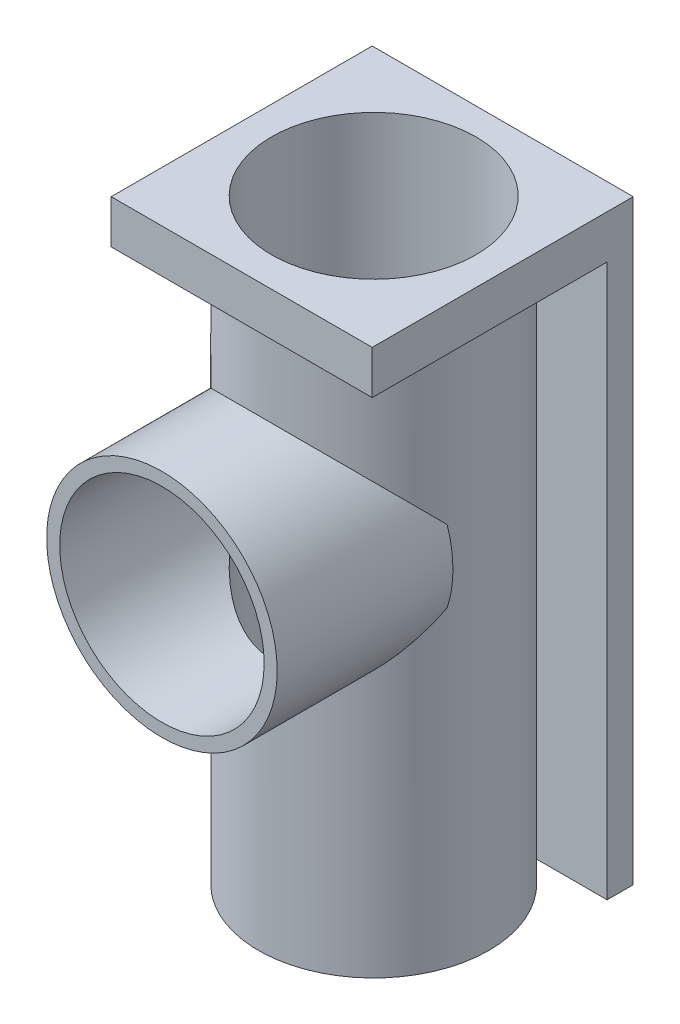
ISO-10303-21;
HEADER;
FILE_DESCRIPTION(('STEP AP214'),'2;1');
FILE_NAME('part.step','',(''),(''),'','','');
FILE_SCHEMA(('AUTOMOTIVE_DESIGN { 1 0 10303 214 1 1 1 1 }'));
ENDSEC;
DATA;
#1=APPLICATION_CONTEXT('core data for automotive mechanical design processes');
#2=APPLICATION_PROTOCOL_DEFINITION('international standard','automotive_design',2000,#1);
#3=PRODUCT_CONTEXT('',#1,'mechanical');
#4=PRODUCT('Part','Part','',(#3));
#5=PRODUCT_RELATED_PRODUCT_CATEGORY('part','',(#4));
#6=PRODUCT_DEFINITION_FORMATION('','',#4);
#7=PRODUCT_DEFINITION_CONTEXT('part definition',#1,'design');
#8=PRODUCT_DEFINITION('design','',#6,#7);
#9=PRODUCT_DEFINITION_SHAPE('','',#8);
#10=(LENGTH_UNIT() NAMED_UNIT(*) SI_UNIT(.MILLI.,.METRE.));
#11=(NAMED_UNIT(*) PLANE_ANGLE_UNIT() SI_UNIT($,.RADIAN.));
#12=(NAMED_UNIT(*) SI_UNIT($,.STERADIAN.) SOLID_ANGLE_UNIT());
#13=UNCERTAINTY_MEASURE_WITH_UNIT(LENGTH_MEASURE(1.E-05),#10,'distance_accuracy_value','');
#14=(GEOMETRIC_REPRESENTATION_CONTEXT(3) GLOBAL_UNCERTAINTY_ASSIGNED_CONTEXT((#13)) GLOBAL_UNIT_ASSIGNED_CONTEXT((#10,
#11,#12)) REPRESENTATION_CONTEXT('',''));
#15=CARTESIAN_POINT('',(0.,0.,0.));
#16=DIRECTION('',(0.,0.,1.));
#17=DIRECTION('',(1.,0.,0.));
#18=AXIS2_PLACEMENT_3D('',#15,#16,#17);
#19=CARTESIAN_POINT('',(0.,0.,-40.8));
#20=DIRECTION('',(0.,0.,-1.));
#21=DIRECTION('',(-1.,0.,0.));
#22=AXIS2_PLACEMENT_3D('',#19,#20,#21);
#23=PLANE('',#22);
#24=CARTESIAN_POINT('',(0.,0.,-40.8));
#25=DIRECTION('',(0.,0.,1.));
#26=DIRECTION('',(1.,0.,0.));
#27=AXIS2_PLACEMENT_3D('',#24,#25,#26);
#28=CIRCLE('',#27,23.5);
#29=CARTESIAN_POINT('',(22.1368062487982,-7.88744629795789,-40.8));
#30=VERTEX_POINT('',#29);
#31=CARTESIAN_POINT('',(22.1368062487981,7.88744629795797,-40.8));
#32=VERTEX_POINT('',#31);
#33=EDGE_CURVE('E154',#30,#32,#28,.T.);
#34=ORIENTED_EDGE('',*,*,#33,.T.);
#35=DIRECTION('',(0.,-1.,0.));
#36=VECTOR('',#35,1.);
#37=CARTESIAN_POINT('',(22.1368062487981,-80.,-40.8));
#38=LINE('',#37,#36);
#39=EDGE_CURVE('E146',#32,#30,#38,.T.);
#40=ORIENTED_EDGE('',*,*,#39,.T.);
#41=EDGE_LOOP('',(#34,#40));
#42=FACE_BOUND('',#41,.T.);
#43=ADVANCED_FACE('F34',(#42),#23,.F.);
#44=CARTESIAN_POINT('',(-30.,57.,-18.3453956246376));
#45=DIRECTION('',(-1.,0.,0.));
#46=DIRECTION('',(0.,0.,1.));
#47=AXIS2_PLACEMENT_3D('',#44,#45,#46);
#48=PLANE('',#47);
#49=DIRECTION('',(0.,0.,-1.));
#50=VECTOR('',#49,1.);
#51=CARTESIAN_POINT('',(-30.,47.,-18.3453956246376));
#52=LINE('',#51,#50);
#53=CARTESIAN_POINT('',(-30.,47.,-18.3453956246376));
#54=VERTEX_POINT('',#53);
#55=CARTESIAN_POINT('',(-30.,47.,-72.3453956246376));
#56=VERTEX_POINT('',#55);
#57=EDGE_CURVE('E240',#54,#56,#52,.T.);
#58=ORIENTED_EDGE('',*,*,#57,.F.);
#59=DIRECTION('',(0.,-1.,0.));
#60=VECTOR('',#59,1.);
#61=CARTESIAN_POINT('',(-30.,57.,-18.3453956246376));
#62=LINE('',#61,#60);
#63=CARTESIAN_POINT('',(-30.,57.,-18.3453956246376));
#64=VERTEX_POINT('',#63);
#65=EDGE_CURVE('E260',#64,#54,#62,.T.);
#66=ORIENTED_EDGE('',*,*,#65,.F.);
#67=DIRECTION('',(0.,0.,-1.));
#68=VECTOR('',#67,1.);
#69=CARTESIAN_POINT('',(-30.,57.,-18.3453956246376));
#70=LINE('',#69,#68);
#71=CARTESIAN_POINT('',(-30.,57.,-78.3453956246376));
#72=VERTEX_POINT('',#71);
#73=EDGE_CURVE('E241',#64,#72,#70,.T.);
#74=ORIENTED_EDGE('',*,*,#73,.T.);
#75=DIRECTION('',(0.,-1.,0.));
#76=VECTOR('',#75,1.);
#77=CARTESIAN_POINT('',(-30.,57.,-78.3453956246376));
#78=LINE('',#77,#76);
#79=CARTESIAN_POINT('',(-30.,-80.,-78.3453956246376));
#80=VERTEX_POINT('',#79);
#81=EDGE_CURVE('E254',#72,#80,#78,.T.);
#82=ORIENTED_EDGE('',*,*,#81,.T.);
#83=DIRECTION('',(0.,0.,-1.));
#84=VECTOR('',#83,1.);
#85=CARTESIAN_POINT('',(-30.,-80.,-78.3453956246376));
#86=LINE('',#85,#84);
#87=CARTESIAN_POINT('',(-30.,-80.,-72.3453956246376));
#88=VERTEX_POINT('',#87);
#89=EDGE_CURVE('E211',#88,#80,#86,.T.);
#90=ORIENTED_EDGE('',*,*,#89,.F.);
#91=DIRECTION('',(0.,1.,0.));
#92=VECTOR('',#91,1.);
#93=CARTESIAN_POINT('',(-30.,-80.,-72.3453956246376));
#94=LINE('',#93,#92);
#95=EDGE_CURVE('E234',#88,#56,#94,.T.);
#96=ORIENTED_EDGE('',*,*,#95,.T.);
#97=EDGE_LOOP('',(#58,#66,#74,#82,#90,#96));
#98=FACE_BOUND('',#97,.T.);
#99=ADVANCED_FACE('F36',(#98),#48,.T.);
#100=CARTESIAN_POINT('',(30.,57.,-18.3453956246376));
#101=DIRECTION('',(0.,0.,1.));
#102=DIRECTION('',(1.,0.,0.));
#103=AXIS2_PLACEMENT_3D('',#100,#101,#102);
#104=PLANE('',#103);
#105=DIRECTION('',(-1.,0.,0.));
#106=VECTOR('',#105,1.);
#107=CARTESIAN_POINT('',(30.,47.,-18.3453956246376));
#108=LINE('',#107,#106);
#109=CARTESIAN_POINT('',(30.,47.,-18.3453956246376));
#110=VERTEX_POINT('',#109);
#111=EDGE_CURVE('E245',#110,#54,#108,.T.);
#112=ORIENTED_EDGE('',*,*,#111,.F.);
#113=DIRECTION('',(0.,-1.,0.));
#114=VECTOR('',#113,1.);
#115=CARTESIAN_POINT('',(30.,57.,-18.3453956246376));
#116=LINE('',#115,#114);
#117=CARTESIAN_POINT('',(30.,57.,-18.3453956246376));
#118=VERTEX_POINT('',#117);
#119=EDGE_CURVE('E263',#118,#110,#116,.T.);
#120=ORIENTED_EDGE('',*,*,#119,.F.);
#121=DIRECTION('',(-1.,0.,0.));
#122=VECTOR('',#121,1.);
#123=CARTESIAN_POINT('',(30.,57.,-18.3453956246376));
#124=LINE('',#123,#122);
#125=EDGE_CURVE('E251',#118,#64,#124,.T.);
#126=ORIENTED_EDGE('',*,*,#125,.T.);
#127=ORIENTED_EDGE('',*,*,#65,.T.);
#128=EDGE_LOOP('',(#112,#120,#126,#127));
#129=FACE_BOUND('',#128,.T.);
#130=ADVANCED_FACE('F307',(#129),#104,.T.);
#131=CARTESIAN_POINT('',(30.,57.,-78.3453956246376));
#132=DIRECTION('',(1.,0.,0.));
#133=DIRECTION('',(0.,0.,-1.));
#134=AXIS2_PLACEMENT_3D('',#131,#132,#133);
#135=PLANE('',#134);
#136=DIRECTION('',(0.,0.,1.));
#137=VECTOR('',#136,1.);
#138=CARTESIAN_POINT('',(30.,47.,-78.3453956246376));
#139=LINE('',#138,#137);
#140=CARTESIAN_POINT('',(30.,47.,-72.3453956246376));
#141=VERTEX_POINT('',#140);
#142=EDGE_CURVE('E256',#141,#110,#139,.T.);
#143=ORIENTED_EDGE('',*,*,#142,.F.);
#144=DIRECTION('',(0.,1.,0.));
#145=VECTOR('',#144,1.);
#146=CARTESIAN_POINT('',(30.,-80.,-72.3453956246376));
#147=LINE('',#146,#145);
#148=CARTESIAN_POINT('',(30.,-80.,-72.3453956246376));
#149=VERTEX_POINT('',#148);
#150=EDGE_CURVE('E231',#149,#141,#147,.T.);
#151=ORIENTED_EDGE('',*,*,#150,.F.);
#152=DIRECTION('',(0.,0.,1.));
#153=VECTOR('',#152,1.);
#154=CARTESIAN_POINT('',(30.,-80.,-72.3453956246376));
#155=LINE('',#154,#153);
#156=CARTESIAN_POINT('',(30.,-80.,-78.3453956246376));
#157=VERTEX_POINT('',#156);
#158=EDGE_CURVE('E217',#157,#149,#155,.T.);
#159=ORIENTED_EDGE('',*,*,#158,.F.);
#160=DIRECTION('',(0.,-1.,0.));
#161=VECTOR('',#160,1.);
#162=CARTESIAN_POINT('',(30.,57.,-78.3453956246376));
#163=LINE('',#162,#161);
#164=CARTESIAN_POINT('',(30.,57.,-78.3453956246376));
#165=VERTEX_POINT('',#164);
#166=EDGE_CURVE('E266',#165,#157,#163,.T.);
#167=ORIENTED_EDGE('',*,*,#166,.F.);
#168=DIRECTION('',(0.,0.,1.));
#169=VECTOR('',#168,1.);
#170=CARTESIAN_POINT('',(30.,57.,-78.3453956246376));
#171=LINE('',#170,#169);
#172=EDGE_CURVE('E248',#165,#118,#171,.T.);
#173=ORIENTED_EDGE('',*,*,#172,.T.);
#174=ORIENTED_EDGE('',*,*,#119,.T.);
#175=EDGE_LOOP('',(#143,#151,#159,#167,#173,#174));
#176=FACE_BOUND('',#175,.T.);
#177=ADVANCED_FACE('F347',(#176),#135,.T.);
#178=CARTESIAN_POINT('',(-30.,57.,-78.3453956246376));
#179=DIRECTION('',(0.,0.,-1.));
#180=DIRECTION('',(-1.,0.,0.));
#181=AXIS2_PLACEMENT_3D('',#178,#179,#180);
#182=PLANE('',#181);
#183=ORIENTED_EDGE('',*,*,#166,.T.);
#184=DIRECTION('',(1.,0.,0.));
#185=VECTOR('',#184,1.);
#186=CARTESIAN_POINT('',(30.,-80.,-78.3453956246376));
#187=LINE('',#186,#185);
#188=EDGE_CURVE('E214',#80,#157,#187,.T.);
#189=ORIENTED_EDGE('',*,*,#188,.F.);
#190=ORIENTED_EDGE('',*,*,#81,.F.);
#191=DIRECTION('',(1.,0.,0.));
#192=VECTOR('',#191,1.);
#193=CARTESIAN_POINT('',(-30.,57.,-78.3453956246376));
#194=LINE('',#193,#192);
#195=EDGE_CURVE('E244',#72,#165,#194,.T.);
#196=ORIENTED_EDGE('',*,*,#195,.T.);
#197=EDGE_LOOP('',(#183,#189,#190,#196));
#198=FACE_BOUND('',#197,.T.);
#199=ADVANCED_FACE('F342',(#198),#182,.T.);
#200=CARTESIAN_POINT('',(0.,57.,0.));
#201=DIRECTION('',(0.,-1.,0.));
#202=DIRECTION('',(0.,0.,-1.));
#203=AXIS2_PLACEMENT_3D('',#200,#201,#202);
#204=PLANE('',#203);
#205=CARTESIAN_POINT('',(0.,57.,-48.6874462979579));
#206=DIRECTION('',(0.,-1.,0.));
#207=DIRECTION('',(0.,0.,-1.));
#208=AXIS2_PLACEMENT_3D('',#205,#206,#207);
#209=CIRCLE('',#208,23.5);
#210=CARTESIAN_POINT('',(0.,57.,-72.1874462979579));
#211=VERTEX_POINT('',#210);
#212=EDGE_CURVE('E315',#211,#211,#209,.T.);
#213=ORIENTED_EDGE('',*,*,#212,.T.);
#214=EDGE_LOOP('',(#213));
#215=FACE_BOUND('',#214,.T.);
#216=ORIENTED_EDGE('',*,*,#73,.F.);
#217=ORIENTED_EDGE('',*,*,#125,.F.);
#218=ORIENTED_EDGE('',*,*,#172,.F.);
#219=ORIENTED_EDGE('',*,*,#195,.F.);
#220=EDGE_LOOP('',(#216,#217,#218,#219));
#221=FACE_BOUND('',#220,.T.);
#222=ADVANCED_FACE('F352',(#215,#221),#204,.F.);
#223=CARTESIAN_POINT('',(0.,47.,0.));
#224=DIRECTION('',(0.,-1.,0.));
#225=DIRECTION('',(0.,0.,-1.));
#226=AXIS2_PLACEMENT_3D('',#223,#224,#225);
#227=PLANE('',#226);
#228=DIRECTION('',(-1.,0.,0.));
#229=VECTOR('',#228,1.);
#230=CARTESIAN_POINT('',(11.9394905107485,47.,-72.3453956246376));
#231=LINE('',#230,#229);
#232=CARTESIAN_POINT('',(11.9394905107485,47.,-72.3453956246376));
#233=VERTEX_POINT('',#232);
#234=EDGE_CURVE('E209',#141,#233,#231,.T.);
#235=ORIENTED_EDGE('',*,*,#234,.F.);
#236=ORIENTED_EDGE('',*,*,#142,.T.);
#237=ORIENTED_EDGE('',*,*,#111,.T.);
#238=ORIENTED_EDGE('',*,*,#57,.T.);
#239=DIRECTION('',(-1.,0.,0.));
#240=VECTOR('',#239,1.);
#241=CARTESIAN_POINT('',(-30.,47.,-72.3453956246376));
#242=LINE('',#241,#240);
#243=CARTESIAN_POINT('',(-11.9394905107485,47.,-72.3453956246376));
#244=VERTEX_POINT('',#243);
#245=EDGE_CURVE('E224',#244,#56,#242,.T.);
#246=ORIENTED_EDGE('',*,*,#245,.F.);
#247=CARTESIAN_POINT('',(0.,47.,-48.6874462979579));
#248=DIRECTION('',(0.,-1.,0.));
#249=DIRECTION('',(0.,0.,1.));
#250=AXIS2_PLACEMENT_3D('',#247,#248,#249);
#251=CIRCLE('',#250,26.5);
#252=EDGE_CURVE('E199',#233,#244,#251,.T.);
#253=ORIENTED_EDGE('',*,*,#252,.F.);
#254=EDGE_LOOP('',(#235,#236,#237,#238,#246,#253));
#255=FACE_BOUND('',#254,.T.);
#256=ADVANCED_FACE('F357',(#255),#227,.T.);
#257=CARTESIAN_POINT('',(0.,-80.,-48.6874462979579));
#258=DIRECTION('',(0.,1.,0.));
#259=DIRECTION('',(0.,0.,1.));
#260=AXIS2_PLACEMENT_3D('',#257,#258,#259);
#261=CYLINDRICAL_SURFACE('',#260,26.5);
#262=CARTESIAN_POINT('',(0.,0.,-48.6874462979579));
#263=DIRECTION('',(0.,0.707106781186547,0.707106781186547));
#264=DIRECTION('',(0.,0.707106781186547,-0.707106781186547));
#265=AXIS2_PLACEMENT_3D('',#262,#263,#264);
#266=ELLIPSE('',#265,37.476659402887,26.5);
#267=CARTESIAN_POINT('',(25.170781351767,-8.28744629795801,-40.4));
#268=VERTEX_POINT('',#267);
#269=CARTESIAN_POINT('',(-25.170781351767,-8.28744629795801,-40.4));
#270=VERTEX_POINT('',#269);
#271=EDGE_CURVE('E277',#268,#270,#266,.F.);
#272=ORIENTED_EDGE('',*,*,#271,.T.);
#273=DIRECTION('',(0.,1.,0.));
#274=VECTOR('',#273,1.);
#275=CARTESIAN_POINT('',(-25.170781351767,-80.,-40.4));
#276=LINE('',#275,#274);
#277=CARTESIAN_POINT('',(-25.170781351767,8.28744629795801,-40.4));
#278=VERTEX_POINT('',#277);
#279=EDGE_CURVE('E151',#270,#278,#276,.T.);
#280=ORIENTED_EDGE('',*,*,#279,.T.);
#281=CARTESIAN_POINT('',(0.,0.,-48.6874462979579));
#282=DIRECTION('',(0.,0.707106781186547,-0.707106781186547));
#283=DIRECTION('',(0.,0.707106781186547,0.707106781186547));
#284=AXIS2_PLACEMENT_3D('',#281,#282,#283);
#285=ELLIPSE('',#284,37.476659402887,26.5);
#286=CARTESIAN_POINT('',(25.170781351767,8.28744629795801,-40.4));
#287=VERTEX_POINT('',#286);
#288=EDGE_CURVE('E274',#278,#287,#285,.T.);
#289=ORIENTED_EDGE('',*,*,#288,.T.);
#290=DIRECTION('',(0.,1.,0.));
#291=VECTOR('',#290,1.);
#292=CARTESIAN_POINT('',(25.170781351767,-80.,-40.4));
#293=LINE('',#292,#291);
#294=EDGE_CURVE('E271',#287,#268,#293,.F.);
#295=ORIENTED_EDGE('',*,*,#294,.T.);
#296=EDGE_LOOP('',(#272,#280,#289,#295));
#297=FACE_BOUND('',#296,.T.);
#298=ORIENTED_EDGE('',*,*,#252,.T.);
#299=DIRECTION('',(0.,1.,0.));
#300=VECTOR('',#299,1.);
#301=CARTESIAN_POINT('',(-11.9394905107485,-80.,-72.3453956246376));
#302=LINE('',#301,#300);
#303=CARTESIAN_POINT('',(-11.9394905107485,-80.,-72.3453956246376));
#304=VERTEX_POINT('',#303);
#305=EDGE_CURVE('E237',#304,#244,#302,.T.);
#306=ORIENTED_EDGE('',*,*,#305,.F.);
#307=CARTESIAN_POINT('',(0.,-80.,-48.6874462979579));
#308=DIRECTION('',(0.,-1.,0.));
#309=DIRECTION('',(0.,0.,1.));
#310=AXIS2_PLACEMENT_3D('',#307,#308,#309);
#311=CIRCLE('',#310,26.5);
#312=CARTESIAN_POINT('',(11.9394905107485,-80.,-72.3453956246376));
#313=VERTEX_POINT('',#312);
#314=EDGE_CURVE('E205',#313,#304,#311,.T.);
#315=ORIENTED_EDGE('',*,*,#314,.F.);
#316=DIRECTION('',(0.,1.,0.));
#317=VECTOR('',#316,1.);
#318=CARTESIAN_POINT('',(11.9394905107485,-80.,-72.3453956246376));
#319=LINE('',#318,#317);
#320=EDGE_CURVE('E221',#313,#233,#319,.T.);
#321=ORIENTED_EDGE('',*,*,#320,.T.);
#322=EDGE_LOOP('',(#298,#306,#315,#321));
#323=FACE_BOUND('',#322,.T.);
#324=ADVANCED_FACE('F282',(#297,#323),#261,.T.);
#325=CARTESIAN_POINT('',(-30.,-80.,-72.3453956246376));
#326=DIRECTION('',(0.,0.,-1.));
#327=DIRECTION('',(-1.,0.,0.));
#328=AXIS2_PLACEMENT_3D('',#325,#326,#327);
#329=PLANE('',#328);
#330=ORIENTED_EDGE('',*,*,#245,.T.);
#331=ORIENTED_EDGE('',*,*,#95,.F.);
#332=DIRECTION('',(-1.,0.,0.));
#333=VECTOR('',#332,1.);
#334=CARTESIAN_POINT('',(-30.,-80.,-72.3453956246376));
#335=LINE('',#334,#333);
#336=EDGE_CURVE('E208',#304,#88,#335,.T.);
#337=ORIENTED_EDGE('',*,*,#336,.F.);
#338=ORIENTED_EDGE('',*,*,#305,.T.);
#339=EDGE_LOOP('',(#330,#331,#337,#338));
#340=FACE_BOUND('',#339,.T.);
#341=ADVANCED_FACE('F336',(#340),#329,.F.);
#342=CARTESIAN_POINT('',(11.9394905107485,-80.,-72.3453956246376));
#343=DIRECTION('',(0.,0.,-1.));
#344=DIRECTION('',(-1.,0.,0.));
#345=AXIS2_PLACEMENT_3D('',#342,#343,#344);
#346=PLANE('',#345);
#347=ORIENTED_EDGE('',*,*,#234,.T.);
#348=ORIENTED_EDGE('',*,*,#320,.F.);
#349=DIRECTION('',(-1.,0.,0.));
#350=VECTOR('',#349,1.);
#351=CARTESIAN_POINT('',(11.9394905107485,-80.,-72.3453956246376));
#352=LINE('',#351,#350);
#353=EDGE_CURVE('E219',#149,#313,#352,.T.);
#354=ORIENTED_EDGE('',*,*,#353,.F.);
#355=ORIENTED_EDGE('',*,*,#150,.T.);
#356=EDGE_LOOP('',(#347,#348,#354,#355));
#357=FACE_BOUND('',#356,.T.);
#358=ADVANCED_FACE('F328',(#357),#346,.F.);
#359=CARTESIAN_POINT('',(0.,-80.,-48.6874462979579));
#360=DIRECTION('',(0.,1.,0.));
#361=DIRECTION('',(0.,0.,1.));
#362=AXIS2_PLACEMENT_3D('',#359,#360,#361);
#363=PLANE('',#362);
#364=CARTESIAN_POINT('',(0.,-80.,-48.6874462979579));
#365=DIRECTION('',(0.,-1.,0.));
#366=DIRECTION('',(0.,0.,-1.));
#367=AXIS2_PLACEMENT_3D('',#364,#365,#366);
#368=CIRCLE('',#367,23.5);
#369=CARTESIAN_POINT('',(0.,-80.,-72.1874462979579));
#370=VERTEX_POINT('',#369);
#371=EDGE_CURVE('E318',#370,#370,#368,.T.);
#372=ORIENTED_EDGE('',*,*,#371,.F.);
#373=EDGE_LOOP('',(#372));
#374=FACE_BOUND('',#373,.T.);
#375=ORIENTED_EDGE('',*,*,#314,.T.);
#376=ORIENTED_EDGE('',*,*,#336,.T.);
#377=ORIENTED_EDGE('',*,*,#89,.T.);
#378=ORIENTED_EDGE('',*,*,#188,.T.);
#379=ORIENTED_EDGE('',*,*,#158,.T.);
#380=ORIENTED_EDGE('',*,*,#353,.T.);
#381=EDGE_LOOP('',(#375,#376,#377,#378,#379,#380));
#382=FACE_BOUND('',#381,.T.);
#383=ADVANCED_FACE('F325',(#374,#382),#363,.F.);
#384=CARTESIAN_POINT('',(0.,0.,-40.4));
#385=DIRECTION('',(0.,0.,1.));
#386=DIRECTION('',(1.,0.,0.));
#387=AXIS2_PLACEMENT_3D('',#384,#385,#386);
#388=CYLINDRICAL_SURFACE('',#387,26.5);
#389=CARTESIAN_POINT('',(0.,0.,0.));
#390=DIRECTION('',(0.,0.,1.));
#391=DIRECTION('',(1.,0.,0.));
#392=AXIS2_PLACEMENT_3D('',#389,#390,#391);
#393=CIRCLE('',#392,26.5);
#394=CARTESIAN_POINT('',(26.5,0.,0.));
#395=VERTEX_POINT('',#394);
#396=EDGE_CURVE('E166',#395,#395,#393,.T.);
#397=ORIENTED_EDGE('',*,*,#396,.F.);
#398=EDGE_LOOP('',(#397));
#399=FACE_BOUND('',#398,.T.);
#400=ORIENTED_EDGE('',*,*,#271,.F.);
#401=CARTESIAN_POINT('',(0.,0.,-40.4));
#402=DIRECTION('',(0.,0.,1.));
#403=DIRECTION('',(1.,0.,0.));
#404=AXIS2_PLACEMENT_3D('',#401,#402,#403);
#405=CIRCLE('',#404,26.5);
#406=EDGE_CURVE('E56',#268,#287,#405,.T.);
#407=ORIENTED_EDGE('',*,*,#406,.T.);
#408=ORIENTED_EDGE('',*,*,#288,.F.);
#409=EDGE_CURVE('E165',#278,#270,#405,.T.);
#410=ORIENTED_EDGE('',*,*,#409,.T.);
#411=EDGE_LOOP('',(#400,#407,#408,#410));
#412=FACE_BOUND('',#411,.T.);
#413=ADVANCED_FACE('F289',(#399,#412),#388,.T.);
#414=CARTESIAN_POINT('',(26.5,0.,-40.4));
#415=DIRECTION('',(0.,0.,-1.));
#416=DIRECTION('',(-1.,0.,0.));
#417=AXIS2_PLACEMENT_3D('',#414,#415,#416);
#418=PLANE('',#417);
#419=ORIENTED_EDGE('',*,*,#279,.F.);
#420=ORIENTED_EDGE('',*,*,#409,.F.);
#421=EDGE_LOOP('',(#419,#420));
#422=FACE_BOUND('',#421,.T.);
#423=ADVANCED_FACE('F287',(#422),#418,.T.);
#424=ORIENTED_EDGE('',*,*,#294,.F.);
#425=ORIENTED_EDGE('',*,*,#406,.F.);
#426=EDGE_LOOP('',(#424,#425));
#427=FACE_BOUND('',#426,.T.);
#428=ADVANCED_FACE('F290',(#427),#418,.T.);
#429=CARTESIAN_POINT('',(0.,0.,0.));
#430=DIRECTION('',(0.,0.,1.));
#431=DIRECTION('',(1.,0.,0.));
#432=AXIS2_PLACEMENT_3D('',#429,#430,#431);
#433=PLANE('',#432);
#434=CARTESIAN_POINT('',(0.,0.,0.));
#435=DIRECTION('',(0.,0.,1.));
#436=DIRECTION('',(1.,0.,0.));
#437=AXIS2_PLACEMENT_3D('',#434,#435,#436);
#438=CIRCLE('',#437,23.5);
#439=CARTESIAN_POINT('',(23.5,0.,0.));
#440=VERTEX_POINT('',#439);
#441=EDGE_CURVE('E155',#440,#440,#438,.T.);
#442=ORIENTED_EDGE('',*,*,#441,.F.);
#443=EDGE_LOOP('',(#442));
#444=FACE_BOUND('',#443,.T.);
#445=ORIENTED_EDGE('',*,*,#396,.T.);
#446=EDGE_LOOP('',(#445));
#447=FACE_BOUND('',#446,.T.);
#448=ADVANCED_FACE('F292',(#444,#447),#433,.T.);
#449=CARTESIAN_POINT('',(-22.1368062487981,7.88744629795797,-40.8));
#450=VERTEX_POINT('',#449);
#451=CARTESIAN_POINT('',(-22.1368062487982,-7.88744629795789,-40.8));
#452=VERTEX_POINT('',#451);
#453=EDGE_CURVE('E159',#450,#452,#28,.T.);
#454=ORIENTED_EDGE('',*,*,#453,.T.);
#455=DIRECTION('',(0.,-1.,0.));
#456=VECTOR('',#455,1.);
#457=CARTESIAN_POINT('',(-22.1368062487981,-80.,-40.8));
#458=LINE('',#457,#456);
#459=EDGE_CURVE('E49',#452,#450,#458,.F.);
#460=ORIENTED_EDGE('',*,*,#459,.T.);
#461=EDGE_LOOP('',(#454,#460));
#462=FACE_BOUND('',#461,.T.);
#463=ADVANCED_FACE('F298',(#462),#23,.F.);
#464=CARTESIAN_POINT('',(0.,0.,0.));
#465=DIRECTION('',(0.,0.,1.));
#466=DIRECTION('',(1.,0.,0.));
#467=AXIS2_PLACEMENT_3D('',#464,#465,#466);
#468=CYLINDRICAL_SURFACE('',#467,23.5);
#469=ORIENTED_EDGE('',*,*,#453,.F.);
#470=CARTESIAN_POINT('',(0.,0.,-48.6874462979579));
#471=DIRECTION('',(0.,-0.707106781186547,0.707106781186547));
#472=DIRECTION('',(0.,0.707106781186547,0.707106781186547));
#473=AXIS2_PLACEMENT_3D('',#470,#471,#472);
#474=ELLIPSE('',#473,33.2340187157677,23.5);
#475=EDGE_CURVE('E11',#450,#32,#474,.F.);
#476=ORIENTED_EDGE('',*,*,#475,.T.);
#477=ORIENTED_EDGE('',*,*,#33,.F.);
#478=CARTESIAN_POINT('',(0.,0.,-48.6874462979579));
#479=DIRECTION('',(0.,0.707106781186547,0.707106781186547));
#480=DIRECTION('',(0.,-0.707106781186547,0.707106781186547));
#481=AXIS2_PLACEMENT_3D('',#478,#479,#480);
#482=ELLIPSE('',#481,33.2340187157677,23.5);
#483=EDGE_CURVE('E42',#30,#452,#482,.F.);
#484=ORIENTED_EDGE('',*,*,#483,.T.);
#485=EDGE_LOOP('',(#469,#476,#477,#484));
#486=FACE_BOUND('',#485,.T.);
#487=ORIENTED_EDGE('',*,*,#441,.T.);
#488=EDGE_LOOP('',(#487));
#489=FACE_BOUND('',#488,.T.);
#490=ADVANCED_FACE('F157',(#486,#489),#468,.F.);
#491=CARTESIAN_POINT('',(0.,-80.,-48.6874462979579));
#492=DIRECTION('',(0.,-1.,0.));
#493=DIRECTION('',(0.,0.,-1.));
#494=AXIS2_PLACEMENT_3D('',#491,#492,#493);
#495=CYLINDRICAL_SURFACE('',#494,23.5);
#496=ORIENTED_EDGE('',*,*,#212,.F.);
#497=EDGE_LOOP('',(#496));
#498=FACE_BOUND('',#497,.T.);
#499=ORIENTED_EDGE('',*,*,#371,.T.);
#500=EDGE_LOOP('',(#499));
#501=FACE_BOUND('',#500,.T.);
#502=ORIENTED_EDGE('',*,*,#459,.F.);
#503=ORIENTED_EDGE('',*,*,#483,.F.);
#504=ORIENTED_EDGE('',*,*,#39,.F.);
#505=ORIENTED_EDGE('',*,*,#475,.F.);
#506=EDGE_LOOP('',(#502,#503,#504,#505));
#507=FACE_BOUND('',#506,.T.);
#508=ADVANCED_FACE('F145',(#498,#501,#507),#495,.F.);
#509=CLOSED_SHELL('',(#43,#99,#130,#177,#199,#222,#256,#324,#341,#358,#383,#413,#423,#428,#448,
#463,#490,#508));
#510=CARTESIAN_POINT('',(27.,50.,-21.3453956246376));
#511=DIRECTION('',(1.,0.,0.));
#512=DIRECTION('',(0.,0.,-1.));
#513=AXIS2_PLACEMENT_3D('',#510,#511,#512);
#514=PLANE('',#513);
#515=DIRECTION('',(0.,0.,-1.));
#516=VECTOR('',#515,1.);
#517=CARTESIAN_POINT('',(27.,54.,-21.3453956246376));
#518=LINE('',#517,#516);
#519=CARTESIAN_POINT('',(27.,54.,-21.3453956246376));
#520=VERTEX_POINT('',#519);
#521=CARTESIAN_POINT('',(27.,54.,-75.3453956246376));
#522=VERTEX_POINT('',#521);
#523=EDGE_CURVE('E172',#520,#522,#518,.T.);
#524=ORIENTED_EDGE('',*,*,#523,.T.);
#525=DIRECTION('',(0.,1.,0.));
#526=VECTOR('',#525,1.);
#527=CARTESIAN_POINT('',(27.,50.,-75.3453956246376));
#528=LINE('',#527,#526);
#529=CARTESIAN_POINT('',(27.,50.,-75.3453956246376));
#530=VERTEX_POINT('',#529);
#531=EDGE_CURVE('E186',#530,#522,#528,.T.);
#532=ORIENTED_EDGE('',*,*,#531,.F.);
#533=DIRECTION('',(0.,0.,-1.));
#534=VECTOR('',#533,1.);
#535=CARTESIAN_POINT('',(27.,50.,-21.3453956246376));
#536=LINE('',#535,#534);
#537=CARTESIAN_POINT('',(27.,50.,-21.3453956246376));
#538=VERTEX_POINT('',#537);
#539=EDGE_CURVE('E173',#538,#530,#536,.T.);
#540=ORIENTED_EDGE('',*,*,#539,.F.);
#541=DIRECTION('',(0.,1.,0.));
#542=VECTOR('',#541,1.);
#543=CARTESIAN_POINT('',(27.,50.,-21.3453956246376));
#544=LINE('',#543,#542);
#545=EDGE_CURVE('E197',#538,#520,#544,.T.);
#546=ORIENTED_EDGE('',*,*,#545,.T.);
#547=EDGE_LOOP('',(#524,#532,#540,#546));
#548=FACE_BOUND('',#547,.T.);
#549=ADVANCED_FACE('F420',(#548),#514,.F.);
#550=CARTESIAN_POINT('',(-27.,50.,-21.3453956246376));
#551=DIRECTION('',(0.,0.,1.));
#552=DIRECTION('',(1.,0.,0.));
#553=AXIS2_PLACEMENT_3D('',#550,#551,#552);
#554=PLANE('',#553);
#555=DIRECTION('',(1.,0.,0.));
#556=VECTOR('',#555,1.);
#557=CARTESIAN_POINT('',(-27.,54.,-21.3453956246376));
#558=LINE('',#557,#556);
#559=CARTESIAN_POINT('',(-27.,54.,-21.3453956246376));
#560=VERTEX_POINT('',#559);
#561=EDGE_CURVE('E177',#560,#520,#558,.T.);
#562=ORIENTED_EDGE('',*,*,#561,.T.);
#563=ORIENTED_EDGE('',*,*,#545,.F.);
#564=DIRECTION('',(1.,0.,0.));
#565=VECTOR('',#564,1.);
#566=CARTESIAN_POINT('',(-27.,50.,-21.3453956246376));
#567=LINE('',#566,#565);
#568=CARTESIAN_POINT('',(-27.,50.,-21.3453956246376));
#569=VERTEX_POINT('',#568);
#570=EDGE_CURVE('E183',#569,#538,#567,.T.);
#571=ORIENTED_EDGE('',*,*,#570,.F.);
#572=DIRECTION('',(0.,1.,0.));
#573=VECTOR('',#572,1.);
#574=CARTESIAN_POINT('',(-27.,50.,-21.3453956246376));
#575=LINE('',#574,#573);
#576=EDGE_CURVE('E200',#569,#560,#575,.T.);
#577=ORIENTED_EDGE('',*,*,#576,.T.);
#578=EDGE_LOOP('',(#562,#563,#571,#577));
#579=FACE_BOUND('',#578,.T.);
#580=ADVANCED_FACE('F424',(#579),#554,.F.);
#581=CARTESIAN_POINT('',(-27.,50.,-75.3453956246376));
#582=DIRECTION('',(-1.,0.,0.));
#583=DIRECTION('',(0.,0.,1.));
#584=AXIS2_PLACEMENT_3D('',#581,#582,#583);
#585=PLANE('',#584);
#586=DIRECTION('',(0.,0.,1.));
#587=VECTOR('',#586,1.);
#588=CARTESIAN_POINT('',(-27.,54.,-75.3453956246376));
#589=LINE('',#588,#587);
#590=CARTESIAN_POINT('',(-27.,54.,-75.3453956246376));
#591=VERTEX_POINT('',#590);
#592=EDGE_CURVE('E192',#591,#560,#589,.T.);
#593=ORIENTED_EDGE('',*,*,#592,.T.);
#594=ORIENTED_EDGE('',*,*,#576,.F.);
#595=DIRECTION('',(0.,0.,1.));
#596=VECTOR('',#595,1.);
#597=CARTESIAN_POINT('',(-27.,50.,-75.3453956246376));
#598=LINE('',#597,#596);
#599=CARTESIAN_POINT('',(-27.,50.,-75.3453956246376));
#600=VERTEX_POINT('',#599);
#601=EDGE_CURVE('E180',#600,#569,#598,.T.);
#602=ORIENTED_EDGE('',*,*,#601,.F.);
#603=DIRECTION('',(0.,1.,0.));
#604=VECTOR('',#603,1.);
#605=CARTESIAN_POINT('',(-27.,50.,-75.3453956246376));
#606=LINE('',#605,#604);
#607=EDGE_CURVE('E202',#600,#591,#606,.T.);
#608=ORIENTED_EDGE('',*,*,#607,.T.);
#609=EDGE_LOOP('',(#593,#594,#602,#608));
#610=FACE_BOUND('',#609,.T.);
#611=ADVANCED_FACE('F433',(#610),#585,.F.);
#612=CARTESIAN_POINT('',(27.,50.,-75.3453956246376));
#613=DIRECTION('',(0.,0.,-1.));
#614=DIRECTION('',(-1.,0.,0.));
#615=AXIS2_PLACEMENT_3D('',#612,#613,#614);
#616=PLANE('',#615);
#617=DIRECTION('',(-1.,0.,0.));
#618=VECTOR('',#617,1.);
#619=CARTESIAN_POINT('',(27.,54.,-75.3453956246376));
#620=LINE('',#619,#618);
#621=EDGE_CURVE('E189',#522,#591,#620,.T.);
#622=ORIENTED_EDGE('',*,*,#621,.T.);
#623=ORIENTED_EDGE('',*,*,#607,.F.);
#624=DIRECTION('',(-1.,0.,0.));
#625=VECTOR('',#624,1.);
#626=CARTESIAN_POINT('',(27.,50.,-75.3453956246376));
#627=LINE('',#626,#625);
#628=EDGE_CURVE('E176',#530,#600,#627,.T.);
#629=ORIENTED_EDGE('',*,*,#628,.F.);
#630=ORIENTED_EDGE('',*,*,#531,.T.);
#631=EDGE_LOOP('',(#622,#623,#629,#630));
#632=FACE_BOUND('',#631,.T.);
#633=ADVANCED_FACE('F441',(#632),#616,.F.);
#634=CARTESIAN_POINT('',(0.,50.,0.));
#635=DIRECTION('',(0.,1.,0.));
#636=DIRECTION('',(0.,0.,1.));
#637=AXIS2_PLACEMENT_3D('',#634,#635,#636);
#638=PLANE('',#637);
#639=CARTESIAN_POINT('',(0.,50.,-48.6874462979579));
#640=DIRECTION('',(0.,1.,0.));
#641=DIRECTION('',(0.,0.,1.));
#642=AXIS2_PLACEMENT_3D('',#639,#640,#641);
#643=CIRCLE('',#642,26.5);
#644=CARTESIAN_POINT('',(0.,50.,-22.1874462979579));
#645=VERTEX_POINT('',#644);
#646=EDGE_CURVE('E262',#645,#645,#643,.T.);
#647=ORIENTED_EDGE('',*,*,#646,.F.);
#648=EDGE_LOOP('',(#647));
#649=FACE_BOUND('',#648,.T.);
#650=ORIENTED_EDGE('',*,*,#539,.T.);
#651=ORIENTED_EDGE('',*,*,#628,.T.);
#652=ORIENTED_EDGE('',*,*,#601,.T.);
#653=ORIENTED_EDGE('',*,*,#570,.T.);
#654=EDGE_LOOP('',(#650,#651,#652,#653));
#655=FACE_BOUND('',#654,.T.);
#656=ADVANCED_FACE('F449',(#649,#655),#638,.T.);
#657=CARTESIAN_POINT('',(0.,54.,0.));
#658=DIRECTION('',(0.,1.,0.));
#659=DIRECTION('',(0.,0.,1.));
#660=AXIS2_PLACEMENT_3D('',#657,#658,#659);
#661=PLANE('',#660);
#662=CARTESIAN_POINT('',(0.,54.,-48.6874462979579));
#663=DIRECTION('',(0.,1.,0.));
#664=DIRECTION('',(0.,0.,1.));
#665=AXIS2_PLACEMENT_3D('',#662,#663,#664);
#666=CIRCLE('',#665,26.5);
#667=CARTESIAN_POINT('',(0.,54.,-22.1874462979579));
#668=VERTEX_POINT('',#667);
#669=EDGE_CURVE('E169',#668,#668,#666,.T.);
#670=ORIENTED_EDGE('',*,*,#669,.T.);
#671=EDGE_LOOP('',(#670));
#672=FACE_BOUND('',#671,.T.);
#673=ORIENTED_EDGE('',*,*,#523,.F.);
#674=ORIENTED_EDGE('',*,*,#561,.F.);
#675=ORIENTED_EDGE('',*,*,#592,.F.);
#676=ORIENTED_EDGE('',*,*,#621,.F.);
#677=EDGE_LOOP('',(#673,#674,#675,#676));
#678=FACE_BOUND('',#677,.T.);
#679=ADVANCED_FACE('F457',(#672,#678),#661,.F.);
#680=CARTESIAN_POINT('',(0.,50.,-48.6874462979579));
#681=DIRECTION('',(0.,1.,0.));
#682=DIRECTION('',(0.,0.,1.));
#683=AXIS2_PLACEMENT_3D('',#680,#681,#682);
#684=CYLINDRICAL_SURFACE('',#683,26.5);
#685=ORIENTED_EDGE('',*,*,#646,.T.);
#686=EDGE_LOOP('',(#685));
#687=FACE_BOUND('',#686,.T.);
#688=ORIENTED_EDGE('',*,*,#669,.F.);
#689=EDGE_LOOP('',(#688));
#690=FACE_BOUND('',#689,.T.);
#691=ADVANCED_FACE('F465',(#687,#690),#684,.T.);
#692=CLOSED_SHELL('',(#549,#580,#611,#633,#656,#679,#691));
#693=ORIENTED_CLOSED_SHELL('',*,#692,.T.);
#694=BREP_WITH_VOIDS('B2',#509,(#693));
#695=ADVANCED_BREP_SHAPE_REPRESENTATION('',(#18,#694),#14);
#696=SHAPE_DEFINITION_REPRESENTATION(#9,#695);
ENDSEC;
END-ISO-10303-21;
